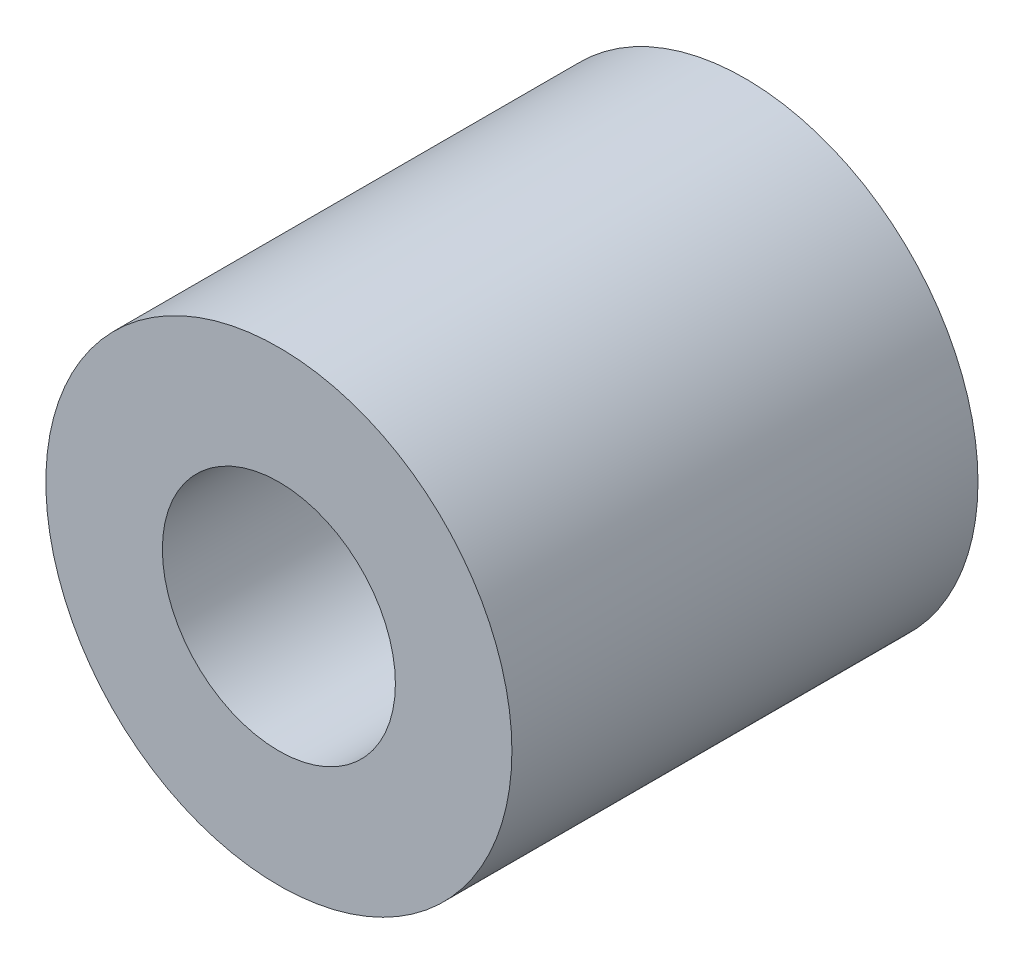
ISO-10303-21;
HEADER;
FILE_DESCRIPTION(('STEP AP214'),'2;1');
FILE_NAME('part.step','',(''),(''),'','','');
FILE_SCHEMA(('AUTOMOTIVE_DESIGN { 1 0 10303 214 1 1 1 1 }'));
ENDSEC;
DATA;
#1=APPLICATION_CONTEXT('core data for automotive mechanical design processes');
#2=APPLICATION_PROTOCOL_DEFINITION('international standard','automotive_design',2000,#1);
#3=PRODUCT_CONTEXT('',#1,'mechanical');
#4=PRODUCT('Part','Part','',(#3));
#5=PRODUCT_RELATED_PRODUCT_CATEGORY('part','',(#4));
#6=PRODUCT_DEFINITION_FORMATION('','',#4);
#7=PRODUCT_DEFINITION_CONTEXT('part definition',#1,'design');
#8=PRODUCT_DEFINITION('design','',#6,#7);
#9=PRODUCT_DEFINITION_SHAPE('','',#8);
#10=(LENGTH_UNIT() NAMED_UNIT(*) SI_UNIT(.MILLI.,.METRE.));
#11=(NAMED_UNIT(*) PLANE_ANGLE_UNIT() SI_UNIT($,.RADIAN.));
#12=(NAMED_UNIT(*) SI_UNIT($,.STERADIAN.) SOLID_ANGLE_UNIT());
#13=UNCERTAINTY_MEASURE_WITH_UNIT(LENGTH_MEASURE(1.E-05),#10,'distance_accuracy_value','');
#14=(GEOMETRIC_REPRESENTATION_CONTEXT(3) GLOBAL_UNCERTAINTY_ASSIGNED_CONTEXT((#13)) GLOBAL_UNIT_ASSIGNED_CONTEXT((#10,
#11,#12)) REPRESENTATION_CONTEXT('',''));
#15=CARTESIAN_POINT('',(0.,0.,0.));
#16=DIRECTION('',(0.,0.,1.));
#17=DIRECTION('',(1.,0.,0.));
#18=AXIS2_PLACEMENT_3D('',#15,#16,#17);
#19=CARTESIAN_POINT('',(0.,0.,5.));
#20=DIRECTION('',(0.,0.,1.));
#21=DIRECTION('',(1.,0.,0.));
#22=AXIS2_PLACEMENT_3D('',#19,#20,#21);
#23=PLANE('',#22);
#24=CARTESIAN_POINT('',(0.,0.,5.));
#25=DIRECTION('',(0.,0.,1.));
#26=DIRECTION('',(1.,0.,0.));
#27=AXIS2_PLACEMENT_3D('',#24,#25,#26);
#28=CIRCLE('',#27,2.5);
#29=CARTESIAN_POINT('',(2.5,0.,5.));
#30=VERTEX_POINT('',#29);
#31=EDGE_CURVE('E10',#30,#30,#28,.T.);
#32=ORIENTED_EDGE('',*,*,#31,.T.);
#33=EDGE_LOOP('',(#32));
#34=FACE_BOUND('',#33,.T.);
#35=CARTESIAN_POINT('',(0.,0.,5.));
#36=DIRECTION('',(0.,0.,1.));
#37=DIRECTION('',(1.,0.,0.));
#38=AXIS2_PLACEMENT_3D('',#35,#36,#37);
#39=CIRCLE('',#38,1.25);
#40=CARTESIAN_POINT('',(1.25,0.,5.));
#41=VERTEX_POINT('',#40);
#42=EDGE_CURVE('E48',#41,#41,#39,.T.);
#43=ORIENTED_EDGE('',*,*,#42,.F.);
#44=EDGE_LOOP('',(#43));
#45=FACE_BOUND('',#44,.T.);
#46=ADVANCED_FACE('F37',(#34,#45),#23,.T.);
#47=CARTESIAN_POINT('',(0.,0.,0.));
#48=DIRECTION('',(0.,0.,1.));
#49=DIRECTION('',(1.,0.,0.));
#50=AXIS2_PLACEMENT_3D('',#47,#48,#49);
#51=PLANE('',#50);
#52=CARTESIAN_POINT('',(0.,0.,0.));
#53=DIRECTION('',(0.,0.,1.));
#54=DIRECTION('',(1.,0.,0.));
#55=AXIS2_PLACEMENT_3D('',#52,#53,#54);
#56=CIRCLE('',#55,2.5);
#57=CARTESIAN_POINT('',(2.5,0.,0.));
#58=VERTEX_POINT('',#57);
#59=EDGE_CURVE('E41',#58,#58,#56,.T.);
#60=ORIENTED_EDGE('',*,*,#59,.F.);
#61=EDGE_LOOP('',(#60));
#62=FACE_BOUND('',#61,.T.);
#63=CARTESIAN_POINT('',(0.,0.,0.));
#64=DIRECTION('',(0.,0.,1.));
#65=DIRECTION('',(1.,0.,0.));
#66=AXIS2_PLACEMENT_3D('',#63,#64,#65);
#67=CIRCLE('',#66,1.25);
#68=CARTESIAN_POINT('',(1.25,0.,0.));
#69=VERTEX_POINT('',#68);
#70=EDGE_CURVE('E50',#69,#69,#67,.T.);
#71=ORIENTED_EDGE('',*,*,#70,.T.);
#72=EDGE_LOOP('',(#71));
#73=FACE_BOUND('',#72,.T.);
#74=ADVANCED_FACE('F60',(#62,#73),#51,.F.);
#75=CARTESIAN_POINT('',(0.,0.,5.));
#76=DIRECTION('',(0.,0.,-1.));
#77=DIRECTION('',(-1.,0.,0.));
#78=AXIS2_PLACEMENT_3D('',#75,#76,#77);
#79=CYLINDRICAL_SURFACE('',#78,2.5);
#80=ORIENTED_EDGE('',*,*,#31,.F.);
#81=EDGE_LOOP('',(#80));
#82=FACE_BOUND('',#81,.T.);
#83=ORIENTED_EDGE('',*,*,#59,.T.);
#84=EDGE_LOOP('',(#83));
#85=FACE_BOUND('',#84,.T.);
#86=ADVANCED_FACE('F39',(#82,#85),#79,.T.);
#87=CARTESIAN_POINT('',(0.,0.,5.));
#88=DIRECTION('',(0.,0.,-1.));
#89=DIRECTION('',(-1.,0.,0.));
#90=AXIS2_PLACEMENT_3D('',#87,#88,#89);
#91=CYLINDRICAL_SURFACE('',#90,1.25);
#92=ORIENTED_EDGE('',*,*,#42,.T.);
#93=EDGE_LOOP('',(#92));
#94=FACE_BOUND('',#93,.T.);
#95=ORIENTED_EDGE('',*,*,#70,.F.);
#96=EDGE_LOOP('',(#95));
#97=FACE_BOUND('',#96,.T.);
#98=ADVANCED_FACE('F56',(#94,#97),#91,.F.);
#99=CLOSED_SHELL('',(#46,#74,#86,#98));
#100=MANIFOLD_SOLID_BREP('B2',#99);
#101=ADVANCED_BREP_SHAPE_REPRESENTATION('',(#18,#100),#14);
#102=SHAPE_DEFINITION_REPRESENTATION(#9,#101);
ENDSEC;
END-ISO-10303-21;
